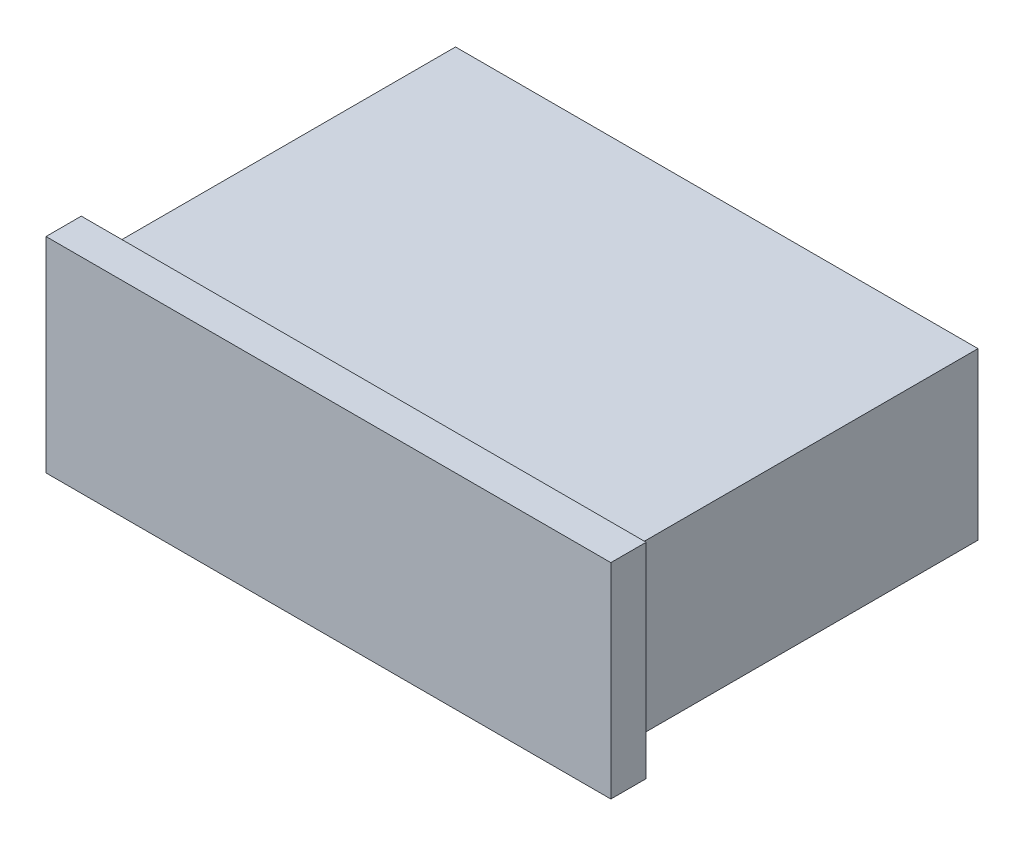
ISO-10303-21;
HEADER;
FILE_DESCRIPTION(('STEP AP214'),'2;1');
FILE_NAME('part.step','',(''),(''),'','','');
FILE_SCHEMA(('AUTOMOTIVE_DESIGN { 1 0 10303 214 1 1 1 1 }'));
ENDSEC;
DATA;
#1=APPLICATION_CONTEXT('core data for automotive mechanical design processes');
#2=APPLICATION_PROTOCOL_DEFINITION('international standard','automotive_design',2000,#1);
#3=PRODUCT_CONTEXT('',#1,'mechanical');
#4=PRODUCT('Part','Part','',(#3));
#5=PRODUCT_RELATED_PRODUCT_CATEGORY('part','',(#4));
#6=PRODUCT_DEFINITION_FORMATION('','',#4);
#7=PRODUCT_DEFINITION_CONTEXT('part definition',#1,'design');
#8=PRODUCT_DEFINITION('design','',#6,#7);
#9=PRODUCT_DEFINITION_SHAPE('','',#8);
#10=(LENGTH_UNIT() NAMED_UNIT(*) SI_UNIT(.MILLI.,.METRE.));
#11=(NAMED_UNIT(*) PLANE_ANGLE_UNIT() SI_UNIT($,.RADIAN.));
#12=(NAMED_UNIT(*) SI_UNIT($,.STERADIAN.) SOLID_ANGLE_UNIT());
#13=UNCERTAINTY_MEASURE_WITH_UNIT(LENGTH_MEASURE(1.E-05),#10,'distance_accuracy_value','');
#14=(GEOMETRIC_REPRESENTATION_CONTEXT(3) GLOBAL_UNCERTAINTY_ASSIGNED_CONTEXT((#13)) GLOBAL_UNIT_ASSIGNED_CONTEXT((#10,
#11,#12)) REPRESENTATION_CONTEXT('',''));
#15=CARTESIAN_POINT('',(0.,0.,0.));
#16=DIRECTION('',(0.,0.,1.));
#17=DIRECTION('',(1.,0.,0.));
#18=AXIS2_PLACEMENT_3D('',#15,#16,#17);
#19=CARTESIAN_POINT('',(0.,0.,5.));
#20=DIRECTION('',(1.,0.,0.));
#21=DIRECTION('',(0.,0.,-1.));
#22=AXIS2_PLACEMENT_3D('',#19,#20,#21);
#23=PLANE('',#22);
#24=DIRECTION('',(0.,-1.,0.));
#25=VECTOR('',#24,1.);
#26=CARTESIAN_POINT('',(0.,0.,0.));
#27=LINE('',#26,#25);
#28=CARTESIAN_POINT('',(0.,2.35,0.));
#29=VERTEX_POINT('',#28);
#30=CARTESIAN_POINT('',(0.,0.,0.));
#31=VERTEX_POINT('',#30);
#32=EDGE_CURVE('E131',#29,#31,#27,.T.);
#33=ORIENTED_EDGE('',*,*,#32,.T.);
#34=DIRECTION('',(0.,0.,-1.));
#35=VECTOR('',#34,1.);
#36=CARTESIAN_POINT('',(0.,0.,5.));
#37=LINE('',#36,#35);
#38=CARTESIAN_POINT('',(0.,0.,5.));
#39=VERTEX_POINT('',#38);
#40=EDGE_CURVE('E11',#39,#31,#37,.T.);
#41=ORIENTED_EDGE('',*,*,#40,.F.);
#42=DIRECTION('',(0.,-1.,0.));
#43=VECTOR('',#42,1.);
#44=CARTESIAN_POINT('',(0.,0.,5.));
#45=LINE('',#44,#43);
#46=CARTESIAN_POINT('',(0.,2.35,5.));
#47=VERTEX_POINT('',#46);
#48=EDGE_CURVE('E140',#47,#39,#45,.T.);
#49=ORIENTED_EDGE('',*,*,#48,.F.);
#50=DIRECTION('',(0.,0.,-1.));
#51=VECTOR('',#50,1.);
#52=CARTESIAN_POINT('',(0.,2.35,5.));
#53=LINE('',#52,#51);
#54=EDGE_CURVE('E149',#47,#29,#53,.T.);
#55=ORIENTED_EDGE('',*,*,#54,.T.);
#56=EDGE_LOOP('',(#33,#41,#49,#55));
#57=FACE_BOUND('',#56,.T.);
#58=ADVANCED_FACE('F33',(#57),#23,.F.);
#59=CARTESIAN_POINT('',(0.,0.,5.));
#60=DIRECTION('',(0.,1.,0.));
#61=DIRECTION('',(0.,0.,1.));
#62=AXIS2_PLACEMENT_3D('',#59,#60,#61);
#63=PLANE('',#62);
#64=DIRECTION('',(1.,0.,0.));
#65=VECTOR('',#64,1.);
#66=CARTESIAN_POINT('',(0.,0.,0.));
#67=LINE('',#66,#65);
#68=CARTESIAN_POINT('',(7.4,0.,0.));
#69=VERTEX_POINT('',#68);
#70=EDGE_CURVE('E134',#31,#69,#67,.T.);
#71=ORIENTED_EDGE('',*,*,#70,.T.);
#72=DIRECTION('',(0.,0.,-1.));
#73=VECTOR('',#72,1.);
#74=CARTESIAN_POINT('',(7.4,0.,5.));
#75=LINE('',#74,#73);
#76=CARTESIAN_POINT('',(7.4,0.,5.));
#77=VERTEX_POINT('',#76);
#78=EDGE_CURVE('E41',#77,#69,#75,.T.);
#79=ORIENTED_EDGE('',*,*,#78,.F.);
#80=DIRECTION('',(1.,0.,0.));
#81=VECTOR('',#80,1.);
#82=CARTESIAN_POINT('',(0.,0.,5.));
#83=LINE('',#82,#81);
#84=EDGE_CURVE('E75',#39,#77,#83,.T.);
#85=ORIENTED_EDGE('',*,*,#84,.F.);
#86=ORIENTED_EDGE('',*,*,#40,.T.);
#87=EDGE_LOOP('',(#71,#79,#85,#86));
#88=FACE_BOUND('',#87,.T.);
#89=ADVANCED_FACE('F175',(#88),#63,.F.);
#90=CARTESIAN_POINT('',(7.4,0.,5.));
#91=DIRECTION('',(-1.,0.,0.));
#92=DIRECTION('',(0.,0.,1.));
#93=AXIS2_PLACEMENT_3D('',#90,#91,#92);
#94=PLANE('',#93);
#95=DIRECTION('',(0.,1.,0.));
#96=VECTOR('',#95,1.);
#97=CARTESIAN_POINT('',(7.4,0.,0.));
#98=LINE('',#97,#96);
#99=CARTESIAN_POINT('',(7.4,2.35,0.));
#100=VERTEX_POINT('',#99);
#101=EDGE_CURVE('E65',#69,#100,#98,.T.);
#102=ORIENTED_EDGE('',*,*,#101,.T.);
#103=DIRECTION('',(0.,0.,-1.));
#104=VECTOR('',#103,1.);
#105=CARTESIAN_POINT('',(7.4,2.35,5.));
#106=LINE('',#105,#104);
#107=CARTESIAN_POINT('',(7.4,2.35,5.));
#108=VERTEX_POINT('',#107);
#109=EDGE_CURVE('E49',#108,#100,#106,.T.);
#110=ORIENTED_EDGE('',*,*,#109,.F.);
#111=DIRECTION('',(0.,1.,0.));
#112=VECTOR('',#111,1.);
#113=CARTESIAN_POINT('',(7.4,0.,5.));
#114=LINE('',#113,#112);
#115=EDGE_CURVE('E144',#77,#108,#114,.T.);
#116=ORIENTED_EDGE('',*,*,#115,.F.);
#117=ORIENTED_EDGE('',*,*,#78,.T.);
#118=EDGE_LOOP('',(#102,#110,#116,#117));
#119=FACE_BOUND('',#118,.T.);
#120=ADVANCED_FACE('F155',(#119),#94,.F.);
#121=CARTESIAN_POINT('',(0.,2.35,5.));
#122=DIRECTION('',(0.,-1.,0.));
#123=DIRECTION('',(0.,0.,-1.));
#124=AXIS2_PLACEMENT_3D('',#121,#122,#123);
#125=PLANE('',#124);
#126=DIRECTION('',(-1.,0.,0.));
#127=VECTOR('',#126,1.);
#128=CARTESIAN_POINT('',(0.,2.35,0.));
#129=LINE('',#128,#127);
#130=EDGE_CURVE('E70',#100,#29,#129,.T.);
#131=ORIENTED_EDGE('',*,*,#130,.T.);
#132=ORIENTED_EDGE('',*,*,#54,.F.);
#133=DIRECTION('',(-1.,0.,0.));
#134=VECTOR('',#133,1.);
#135=CARTESIAN_POINT('',(0.,2.35,5.));
#136=LINE('',#135,#134);
#137=EDGE_CURVE('E147',#108,#47,#136,.T.);
#138=ORIENTED_EDGE('',*,*,#137,.F.);
#139=ORIENTED_EDGE('',*,*,#109,.T.);
#140=EDGE_LOOP('',(#131,#132,#138,#139));
#141=FACE_BOUND('',#140,.T.);
#142=ADVANCED_FACE('F160',(#141),#125,.F.);
#143=CARTESIAN_POINT('',(0.,0.,0.));
#144=DIRECTION('',(0.,0.,-1.));
#145=DIRECTION('',(-1.,0.,0.));
#146=AXIS2_PLACEMENT_3D('',#143,#144,#145);
#147=PLANE('',#146);
#148=ORIENTED_EDGE('',*,*,#32,.F.);
#149=ORIENTED_EDGE('',*,*,#130,.F.);
#150=ORIENTED_EDGE('',*,*,#101,.F.);
#151=ORIENTED_EDGE('',*,*,#70,.F.);
#152=EDGE_LOOP('',(#148,#149,#150,#151));
#153=FACE_BOUND('',#152,.T.);
#154=ADVANCED_FACE('F158',(#153),#147,.T.);
#155=CARTESIAN_POINT('',(0.,0.,5.));
#156=DIRECTION('',(0.,0.,-1.));
#157=DIRECTION('',(-1.,0.,0.));
#158=AXIS2_PLACEMENT_3D('',#155,#156,#157);
#159=PLANE('',#158);
#160=DIRECTION('',(0.,-1.,0.));
#161=VECTOR('',#160,1.);
#162=CARTESIAN_POINT('',(-0.3,-0.275,5.));
#163=LINE('',#162,#161);
#164=CARTESIAN_POINT('',(-0.3,2.625,5.));
#165=VERTEX_POINT('',#164);
#166=CARTESIAN_POINT('',(-0.3,-0.275,5.));
#167=VERTEX_POINT('',#166);
#168=EDGE_CURVE('E130',#165,#167,#163,.T.);
#169=ORIENTED_EDGE('',*,*,#168,.F.);
#170=DIRECTION('',(-1.,0.,0.));
#171=VECTOR('',#170,1.);
#172=CARTESIAN_POINT('',(-0.3,2.625,5.));
#173=LINE('',#172,#171);
#174=CARTESIAN_POINT('',(7.7,2.625,5.));
#175=VERTEX_POINT('',#174);
#176=EDGE_CURVE('E126',#175,#165,#173,.T.);
#177=ORIENTED_EDGE('',*,*,#176,.F.);
#178=DIRECTION('',(0.,1.,0.));
#179=VECTOR('',#178,1.);
#180=CARTESIAN_POINT('',(7.7,-0.275,5.));
#181=LINE('',#180,#179);
#182=CARTESIAN_POINT('',(7.7,-0.275,5.));
#183=VERTEX_POINT('',#182);
#184=EDGE_CURVE('E202',#183,#175,#181,.T.);
#185=ORIENTED_EDGE('',*,*,#184,.F.);
#186=DIRECTION('',(1.,0.,0.));
#187=VECTOR('',#186,1.);
#188=CARTESIAN_POINT('',(-0.3,-0.275,5.));
#189=LINE('',#188,#187);
#190=EDGE_CURVE('E205',#167,#183,#189,.T.);
#191=ORIENTED_EDGE('',*,*,#190,.F.);
#192=EDGE_LOOP('',(#169,#177,#185,#191));
#193=FACE_BOUND('',#192,.T.);
#194=ORIENTED_EDGE('',*,*,#48,.T.);
#195=ORIENTED_EDGE('',*,*,#84,.T.);
#196=ORIENTED_EDGE('',*,*,#115,.T.);
#197=ORIENTED_EDGE('',*,*,#137,.T.);
#198=EDGE_LOOP('',(#194,#195,#196,#197));
#199=FACE_BOUND('',#198,.T.);
#200=ADVANCED_FACE('F162',(#193,#199),#159,.T.);
#201=CARTESIAN_POINT('',(-0.3,-0.275,5.5));
#202=DIRECTION('',(1.,0.,0.));
#203=DIRECTION('',(0.,0.,-1.));
#204=AXIS2_PLACEMENT_3D('',#201,#202,#203);
#205=PLANE('',#204);
#206=ORIENTED_EDGE('',*,*,#168,.T.);
#207=DIRECTION('',(0.,0.,-1.));
#208=VECTOR('',#207,1.);
#209=CARTESIAN_POINT('',(-0.3,-0.275,5.5));
#210=LINE('',#209,#208);
#211=CARTESIAN_POINT('',(-0.3,-0.275,5.5));
#212=VERTEX_POINT('',#211);
#213=EDGE_CURVE('E110',#212,#167,#210,.T.);
#214=ORIENTED_EDGE('',*,*,#213,.F.);
#215=DIRECTION('',(0.,-1.,0.));
#216=VECTOR('',#215,1.);
#217=CARTESIAN_POINT('',(-0.3,-0.275,5.5));
#218=LINE('',#217,#216);
#219=CARTESIAN_POINT('',(-0.3,2.625,5.5));
#220=VERTEX_POINT('',#219);
#221=EDGE_CURVE('E117',#220,#212,#218,.T.);
#222=ORIENTED_EDGE('',*,*,#221,.F.);
#223=DIRECTION('',(0.,0.,-1.));
#224=VECTOR('',#223,1.);
#225=CARTESIAN_POINT('',(-0.3,2.625,5.5));
#226=LINE('',#225,#224);
#227=EDGE_CURVE('E199',#220,#165,#226,.T.);
#228=ORIENTED_EDGE('',*,*,#227,.T.);
#229=EDGE_LOOP('',(#206,#214,#222,#228));
#230=FACE_BOUND('',#229,.T.);
#231=ADVANCED_FACE('F128',(#230),#205,.F.);
#232=CARTESIAN_POINT('',(-0.3,-0.275,5.5));
#233=DIRECTION('',(0.,1.,0.));
#234=DIRECTION('',(0.,0.,1.));
#235=AXIS2_PLACEMENT_3D('',#232,#233,#234);
#236=PLANE('',#235);
#237=ORIENTED_EDGE('',*,*,#190,.T.);
#238=DIRECTION('',(0.,0.,-1.));
#239=VECTOR('',#238,1.);
#240=CARTESIAN_POINT('',(7.7,-0.275,5.5));
#241=LINE('',#240,#239);
#242=CARTESIAN_POINT('',(7.7,-0.275,5.5));
#243=VERTEX_POINT('',#242);
#244=EDGE_CURVE('E113',#243,#183,#241,.T.);
#245=ORIENTED_EDGE('',*,*,#244,.F.);
#246=DIRECTION('',(1.,0.,0.));
#247=VECTOR('',#246,1.);
#248=CARTESIAN_POINT('',(-0.3,-0.275,5.5));
#249=LINE('',#248,#247);
#250=EDGE_CURVE('E106',#212,#243,#249,.T.);
#251=ORIENTED_EDGE('',*,*,#250,.F.);
#252=ORIENTED_EDGE('',*,*,#213,.T.);
#253=EDGE_LOOP('',(#237,#245,#251,#252));
#254=FACE_BOUND('',#253,.T.);
#255=ADVANCED_FACE('F108',(#254),#236,.F.);
#256=CARTESIAN_POINT('',(7.7,-0.275,5.5));
#257=DIRECTION('',(-1.,0.,0.));
#258=DIRECTION('',(0.,0.,1.));
#259=AXIS2_PLACEMENT_3D('',#256,#257,#258);
#260=PLANE('',#259);
#261=ORIENTED_EDGE('',*,*,#184,.T.);
#262=DIRECTION('',(0.,0.,-1.));
#263=VECTOR('',#262,1.);
#264=CARTESIAN_POINT('',(7.7,2.625,5.5));
#265=LINE('',#264,#263);
#266=CARTESIAN_POINT('',(7.7,2.625,5.5));
#267=VERTEX_POINT('',#266);
#268=EDGE_CURVE('E136',#267,#175,#265,.T.);
#269=ORIENTED_EDGE('',*,*,#268,.F.);
#270=DIRECTION('',(0.,1.,0.));
#271=VECTOR('',#270,1.);
#272=CARTESIAN_POINT('',(7.7,-0.275,5.5));
#273=LINE('',#272,#271);
#274=EDGE_CURVE('E116',#243,#267,#273,.T.);
#275=ORIENTED_EDGE('',*,*,#274,.F.);
#276=ORIENTED_EDGE('',*,*,#244,.T.);
#277=EDGE_LOOP('',(#261,#269,#275,#276));
#278=FACE_BOUND('',#277,.T.);
#279=ADVANCED_FACE('F188',(#278),#260,.F.);
#280=CARTESIAN_POINT('',(-0.3,2.625,5.5));
#281=DIRECTION('',(0.,-1.,0.));
#282=DIRECTION('',(0.,0.,-1.));
#283=AXIS2_PLACEMENT_3D('',#280,#281,#282);
#284=PLANE('',#283);
#285=ORIENTED_EDGE('',*,*,#176,.T.);
#286=ORIENTED_EDGE('',*,*,#227,.F.);
#287=DIRECTION('',(-1.,0.,0.));
#288=VECTOR('',#287,1.);
#289=CARTESIAN_POINT('',(-0.3,2.625,5.5));
#290=LINE('',#289,#288);
#291=EDGE_CURVE('E122',#267,#220,#290,.T.);
#292=ORIENTED_EDGE('',*,*,#291,.F.);
#293=ORIENTED_EDGE('',*,*,#268,.T.);
#294=EDGE_LOOP('',(#285,#286,#292,#293));
#295=FACE_BOUND('',#294,.T.);
#296=ADVANCED_FACE('F190',(#295),#284,.F.);
#297=CARTESIAN_POINT('',(0.,0.,5.5));
#298=DIRECTION('',(0.,0.,-1.));
#299=DIRECTION('',(-1.,0.,0.));
#300=AXIS2_PLACEMENT_3D('',#297,#298,#299);
#301=PLANE('',#300);
#302=ORIENTED_EDGE('',*,*,#221,.T.);
#303=ORIENTED_EDGE('',*,*,#250,.T.);
#304=ORIENTED_EDGE('',*,*,#274,.T.);
#305=ORIENTED_EDGE('',*,*,#291,.T.);
#306=EDGE_LOOP('',(#302,#303,#304,#305));
#307=FACE_BOUND('',#306,.T.);
#308=ADVANCED_FACE('F120',(#307),#301,.F.);
#309=CLOSED_SHELL('',(#58,#89,#120,#142,#154,#200,#231,#255,#279,#296,#308));
#310=MANIFOLD_SOLID_BREP('B2',#309);
#311=ADVANCED_BREP_SHAPE_REPRESENTATION('',(#18,#310),#14);
#312=SHAPE_DEFINITION_REPRESENTATION(#9,#311);
ENDSEC;
END-ISO-10303-21;
